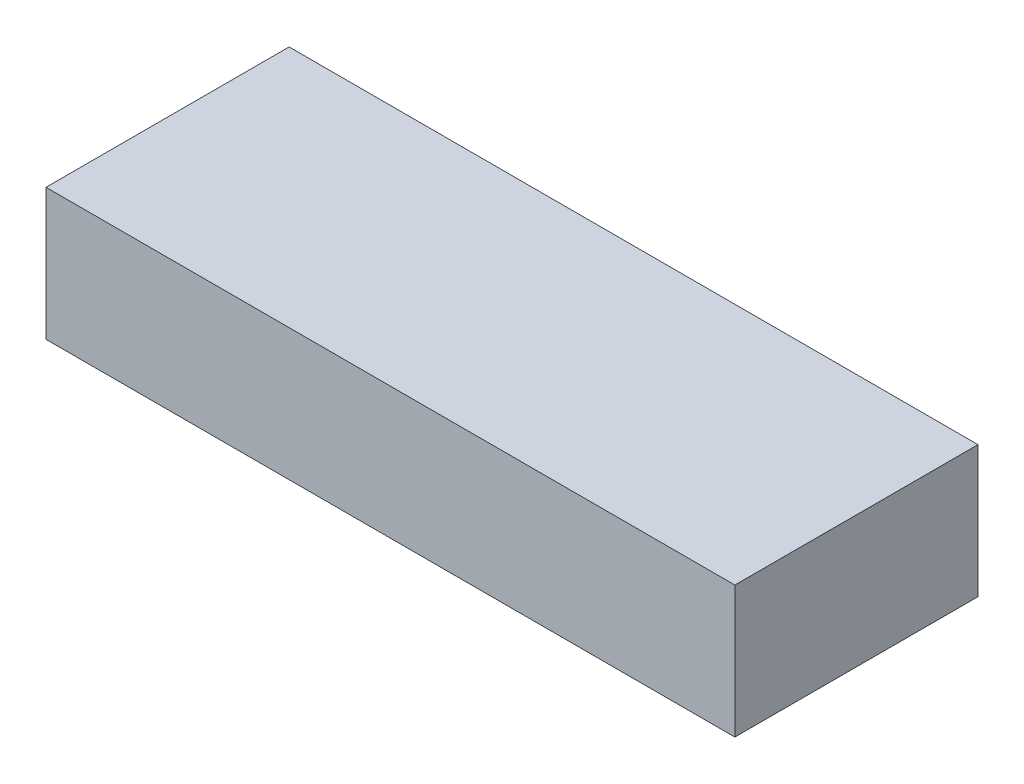
ISO-10303-21;
HEADER;
FILE_DESCRIPTION(('STEP AP214'),'2;1');
FILE_NAME('part.step','',(''),(''),'','','');
FILE_SCHEMA(('AUTOMOTIVE_DESIGN { 1 0 10303 214 1 1 1 1 }'));
ENDSEC;
DATA;
#1=APPLICATION_CONTEXT('core data for automotive mechanical design processes');
#2=APPLICATION_PROTOCOL_DEFINITION('international standard','automotive_design',2000,#1);
#3=PRODUCT_CONTEXT('',#1,'mechanical');
#4=PRODUCT('Part','Part','',(#3));
#5=PRODUCT_RELATED_PRODUCT_CATEGORY('part','',(#4));
#6=PRODUCT_DEFINITION_FORMATION('','',#4);
#7=PRODUCT_DEFINITION_CONTEXT('part definition',#1,'design');
#8=PRODUCT_DEFINITION('design','',#6,#7);
#9=PRODUCT_DEFINITION_SHAPE('','',#8);
#10=(LENGTH_UNIT() NAMED_UNIT(*) SI_UNIT(.MILLI.,.METRE.));
#11=(NAMED_UNIT(*) PLANE_ANGLE_UNIT() SI_UNIT($,.RADIAN.));
#12=(NAMED_UNIT(*) SI_UNIT($,.STERADIAN.) SOLID_ANGLE_UNIT());
#13=UNCERTAINTY_MEASURE_WITH_UNIT(LENGTH_MEASURE(1.E-05),#10,'distance_accuracy_value','');
#14=(GEOMETRIC_REPRESENTATION_CONTEXT(3) GLOBAL_UNCERTAINTY_ASSIGNED_CONTEXT((#13)) GLOBAL_UNIT_ASSIGNED_CONTEXT((#10,
#11,#12)) REPRESENTATION_CONTEXT('',''));
#15=CARTESIAN_POINT('',(0.,0.,0.));
#16=DIRECTION('',(0.,0.,1.));
#17=DIRECTION('',(1.,0.,0.));
#18=AXIS2_PLACEMENT_3D('',#15,#16,#17);
#19=CARTESIAN_POINT('',(86.36,16.51,0.));
#20=DIRECTION('',(0.,-1.,0.));
#21=DIRECTION('',(0.,0.,-1.));
#22=AXIS2_PLACEMENT_3D('',#19,#20,#21);
#23=PLANE('',#22);
#24=DIRECTION('',(-1.,0.,0.));
#25=VECTOR('',#24,1.);
#26=CARTESIAN_POINT('',(86.36,16.51,0.));
#27=LINE('',#26,#25);
#28=CARTESIAN_POINT('',(0.,16.51,0.));
#29=VERTEX_POINT('',#28);
#30=CARTESIAN_POINT('',(86.36,16.51,0.));
#31=VERTEX_POINT('',#30);
#32=EDGE_CURVE('E20',#29,#31,#27,.F.);
#33=ORIENTED_EDGE('',*,*,#32,.T.);
#34=DIRECTION('',(0.,0.,1.));
#35=VECTOR('',#34,1.);
#36=CARTESIAN_POINT('',(86.36,16.51,0.));
#37=LINE('',#36,#35);
#38=CARTESIAN_POINT('',(86.36,16.51,-30.48));
#39=VERTEX_POINT('',#38);
#40=EDGE_CURVE('E55',#31,#39,#37,.F.);
#41=ORIENTED_EDGE('',*,*,#40,.T.);
#42=DIRECTION('',(1.,0.,0.));
#43=VECTOR('',#42,1.);
#44=CARTESIAN_POINT('',(86.36,16.51,-30.48));
#45=LINE('',#44,#43);
#46=CARTESIAN_POINT('',(0.,16.51,-30.48));
#47=VERTEX_POINT('',#46);
#48=EDGE_CURVE('E74',#39,#47,#45,.F.);
#49=ORIENTED_EDGE('',*,*,#48,.T.);
#50=DIRECTION('',(0.,0.,1.));
#51=VECTOR('',#50,1.);
#52=CARTESIAN_POINT('',(0.,16.51,0.));
#53=LINE('',#52,#51);
#54=EDGE_CURVE('E66',#29,#47,#53,.F.);
#55=ORIENTED_EDGE('',*,*,#54,.F.);
#56=EDGE_LOOP('',(#33,#41,#49,#55));
#57=FACE_BOUND('',#56,.T.);
#58=ADVANCED_FACE('F17',(#57),#23,.F.);
#59=CARTESIAN_POINT('',(86.36,0.,0.));
#60=DIRECTION('',(0.,0.,-1.));
#61=DIRECTION('',(-1.,0.,0.));
#62=AXIS2_PLACEMENT_3D('',#59,#60,#61);
#63=PLANE('',#62);
#64=DIRECTION('',(1.,0.,0.));
#65=VECTOR('',#64,1.);
#66=CARTESIAN_POINT('',(86.36,0.,0.));
#67=LINE('',#66,#65);
#68=CARTESIAN_POINT('',(0.,0.,0.));
#69=VERTEX_POINT('',#68);
#70=CARTESIAN_POINT('',(86.36,0.,0.));
#71=VERTEX_POINT('',#70);
#72=EDGE_CURVE('E72',#69,#71,#67,.T.);
#73=ORIENTED_EDGE('',*,*,#72,.T.);
#74=DIRECTION('',(0.,1.,0.));
#75=VECTOR('',#74,1.);
#76=CARTESIAN_POINT('',(86.36,0.,0.));
#77=LINE('',#76,#75);
#78=EDGE_CURVE('E62',#71,#31,#77,.T.);
#79=ORIENTED_EDGE('',*,*,#78,.T.);
#80=ORIENTED_EDGE('',*,*,#32,.F.);
#81=DIRECTION('',(0.,1.,0.));
#82=VECTOR('',#81,1.);
#83=CARTESIAN_POINT('',(0.,0.,0.));
#84=LINE('',#83,#82);
#85=EDGE_CURVE('E78',#69,#29,#84,.T.);
#86=ORIENTED_EDGE('',*,*,#85,.F.);
#87=EDGE_LOOP('',(#73,#79,#80,#86));
#88=FACE_BOUND('',#87,.T.);
#89=ADVANCED_FACE('F71',(#88),#63,.F.);
#90=CARTESIAN_POINT('',(86.36,0.,0.));
#91=DIRECTION('',(-1.,0.,0.));
#92=DIRECTION('',(0.,0.,1.));
#93=AXIS2_PLACEMENT_3D('',#90,#91,#92);
#94=PLANE('',#93);
#95=DIRECTION('',(0.,0.,1.));
#96=VECTOR('',#95,1.);
#97=CARTESIAN_POINT('',(86.36,0.,0.));
#98=LINE('',#97,#96);
#99=CARTESIAN_POINT('',(86.36,0.,-30.48));
#100=VERTEX_POINT('',#99);
#101=EDGE_CURVE('E83',#71,#100,#98,.F.);
#102=ORIENTED_EDGE('',*,*,#101,.T.);
#103=DIRECTION('',(0.,1.,0.));
#104=VECTOR('',#103,1.);
#105=CARTESIAN_POINT('',(86.36,0.,-30.48));
#106=LINE('',#105,#104);
#107=EDGE_CURVE('E64',#100,#39,#106,.T.);
#108=ORIENTED_EDGE('',*,*,#107,.T.);
#109=ORIENTED_EDGE('',*,*,#40,.F.);
#110=ORIENTED_EDGE('',*,*,#78,.F.);
#111=EDGE_LOOP('',(#102,#108,#109,#110));
#112=FACE_BOUND('',#111,.T.);
#113=ADVANCED_FACE('F60',(#112),#94,.F.);
#114=CARTESIAN_POINT('',(86.36,0.,-30.48));
#115=DIRECTION('',(0.,0.,1.));
#116=DIRECTION('',(1.,0.,0.));
#117=AXIS2_PLACEMENT_3D('',#114,#115,#116);
#118=PLANE('',#117);
#119=ORIENTED_EDGE('',*,*,#48,.F.);
#120=ORIENTED_EDGE('',*,*,#107,.F.);
#121=DIRECTION('',(1.,0.,0.));
#122=VECTOR('',#121,1.);
#123=CARTESIAN_POINT('',(86.36,0.,-30.48));
#124=LINE('',#123,#122);
#125=CARTESIAN_POINT('',(0.,0.,-30.48));
#126=VERTEX_POINT('',#125);
#127=EDGE_CURVE('E26',#100,#126,#124,.F.);
#128=ORIENTED_EDGE('',*,*,#127,.T.);
#129=DIRECTION('',(0.,1.,0.));
#130=VECTOR('',#129,1.);
#131=CARTESIAN_POINT('',(0.,0.,-30.48));
#132=LINE('',#131,#130);
#133=EDGE_CURVE('E34',#47,#126,#132,.F.);
#134=ORIENTED_EDGE('',*,*,#133,.F.);
#135=EDGE_LOOP('',(#119,#120,#128,#134));
#136=FACE_BOUND('',#135,.T.);
#137=ADVANCED_FACE('F88',(#136),#118,.F.);
#138=CARTESIAN_POINT('',(0.,0.,0.));
#139=DIRECTION('',(-1.,0.,0.));
#140=DIRECTION('',(0.,0.,1.));
#141=AXIS2_PLACEMENT_3D('',#138,#139,#140);
#142=PLANE('',#141);
#143=ORIENTED_EDGE('',*,*,#133,.T.);
#144=DIRECTION('',(0.,0.,1.));
#145=VECTOR('',#144,1.);
#146=CARTESIAN_POINT('',(0.,0.,0.));
#147=LINE('',#146,#145);
#148=EDGE_CURVE('E11',#126,#69,#147,.T.);
#149=ORIENTED_EDGE('',*,*,#148,.T.);
#150=ORIENTED_EDGE('',*,*,#85,.T.);
#151=ORIENTED_EDGE('',*,*,#54,.T.);
#152=EDGE_LOOP('',(#143,#149,#150,#151));
#153=FACE_BOUND('',#152,.T.);
#154=ADVANCED_FACE('F91',(#153),#142,.T.);
#155=CARTESIAN_POINT('',(86.36,0.,0.));
#156=DIRECTION('',(0.,1.,0.));
#157=DIRECTION('',(0.,0.,1.));
#158=AXIS2_PLACEMENT_3D('',#155,#156,#157);
#159=PLANE('',#158);
#160=ORIENTED_EDGE('',*,*,#127,.F.);
#161=ORIENTED_EDGE('',*,*,#101,.F.);
#162=ORIENTED_EDGE('',*,*,#72,.F.);
#163=ORIENTED_EDGE('',*,*,#148,.F.);
#164=EDGE_LOOP('',(#160,#161,#162,#163));
#165=FACE_BOUND('',#164,.T.);
#166=ADVANCED_FACE('F90',(#165),#159,.F.);
#167=CLOSED_SHELL('',(#58,#89,#113,#137,#154,#166));
#168=MANIFOLD_SOLID_BREP('B1',#167);
#169=ADVANCED_BREP_SHAPE_REPRESENTATION('',(#18,#168),#14);
#170=SHAPE_DEFINITION_REPRESENTATION(#9,#169);
ENDSEC;
END-ISO-10303-21;
